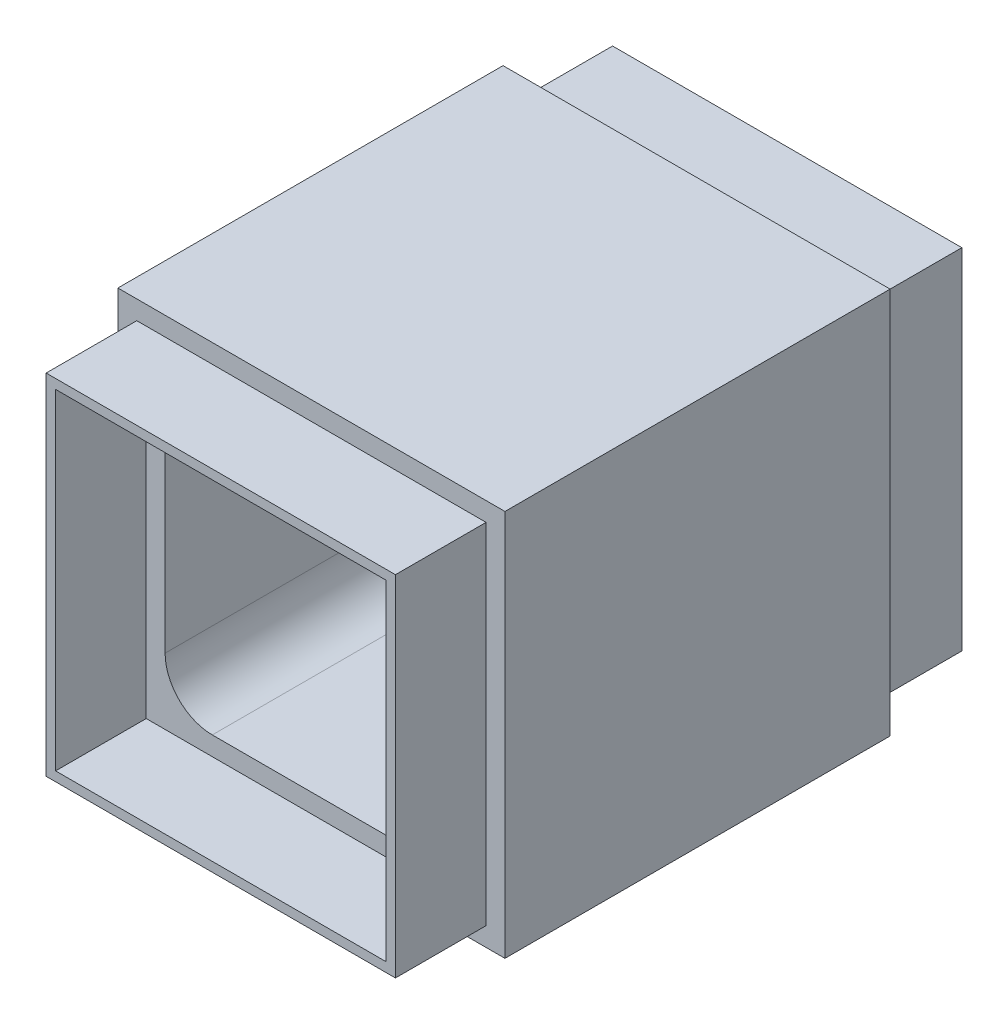
ISO-10303-21;
HEADER;
FILE_DESCRIPTION(('STEP AP214'),'2;1');
FILE_NAME('part.step','',(''),(''),'','','');
FILE_SCHEMA(('AUTOMOTIVE_DESIGN { 1 0 10303 214 1 1 1 1 }'));
ENDSEC;
DATA;
#1=APPLICATION_CONTEXT('core data for automotive mechanical design processes');
#2=APPLICATION_PROTOCOL_DEFINITION('international standard','automotive_design',2000,#1);
#3=PRODUCT_CONTEXT('',#1,'mechanical');
#4=PRODUCT('Part','Part','',(#3));
#5=PRODUCT_RELATED_PRODUCT_CATEGORY('part','',(#4));
#6=PRODUCT_DEFINITION_FORMATION('','',#4);
#7=PRODUCT_DEFINITION_CONTEXT('part definition',#1,'design');
#8=PRODUCT_DEFINITION('design','',#6,#7);
#9=PRODUCT_DEFINITION_SHAPE('','',#8);
#10=(LENGTH_UNIT() NAMED_UNIT(*) SI_UNIT(.MILLI.,.METRE.));
#11=(NAMED_UNIT(*) PLANE_ANGLE_UNIT() SI_UNIT($,.RADIAN.));
#12=(NAMED_UNIT(*) SI_UNIT($,.STERADIAN.) SOLID_ANGLE_UNIT());
#13=UNCERTAINTY_MEASURE_WITH_UNIT(LENGTH_MEASURE(1.E-05),#10,'distance_accuracy_value','');
#14=(GEOMETRIC_REPRESENTATION_CONTEXT(3) GLOBAL_UNCERTAINTY_ASSIGNED_CONTEXT((#13)) GLOBAL_UNIT_ASSIGNED_CONTEXT((#10,
#11,#12)) REPRESENTATION_CONTEXT('',''));
#15=CARTESIAN_POINT('',(0.,0.,0.));
#16=DIRECTION('',(0.,0.,1.));
#17=DIRECTION('',(1.,0.,0.));
#18=AXIS2_PLACEMENT_3D('',#15,#16,#17);
#19=CARTESIAN_POINT('',(0.,0.,-76.2));
#20=DIRECTION('',(-1.,0.,0.));
#21=DIRECTION('',(0.,0.,1.));
#22=AXIS2_PLACEMENT_3D('',#19,#20,#21);
#23=PLANE('',#22);
#24=DIRECTION('',(0.,0.,1.));
#25=VECTOR('',#24,1.);
#26=CARTESIAN_POINT('',(0.,52.07,-76.2));
#27=LINE('',#26,#25);
#28=CARTESIAN_POINT('',(0.,52.07,-64.008));
#29=VERTEX_POINT('',#28);
#30=CARTESIAN_POINT('',(0.,52.07,-12.192));
#31=VERTEX_POINT('',#30);
#32=EDGE_CURVE('E454',#29,#31,#27,.T.);
#33=ORIENTED_EDGE('',*,*,#32,.F.);
#34=DIRECTION('',(0.,-1.,0.));
#35=VECTOR('',#34,1.);
#36=CARTESIAN_POINT('',(0.,0.,-64.008));
#37=LINE('',#36,#35);
#38=CARTESIAN_POINT('',(0.,0.,-64.008));
#39=VERTEX_POINT('',#38);
#40=EDGE_CURVE('E334',#29,#39,#37,.T.);
#41=ORIENTED_EDGE('',*,*,#40,.T.);
#42=DIRECTION('',(0.,0.,1.));
#43=VECTOR('',#42,1.);
#44=CARTESIAN_POINT('',(0.,0.,-76.2));
#45=LINE('',#44,#43);
#46=CARTESIAN_POINT('',(0.,0.,-12.192));
#47=VERTEX_POINT('',#46);
#48=EDGE_CURVE('E446',#39,#47,#45,.T.);
#49=ORIENTED_EDGE('',*,*,#48,.T.);
#50=DIRECTION('',(0.,-1.,0.));
#51=VECTOR('',#50,1.);
#52=CARTESIAN_POINT('',(0.,0.,-12.192));
#53=LINE('',#52,#51);
#54=EDGE_CURVE('E413',#31,#47,#53,.T.);
#55=ORIENTED_EDGE('',*,*,#54,.F.);
#56=EDGE_LOOP('',(#33,#41,#49,#55));
#57=FACE_BOUND('',#56,.T.);
#58=ADVANCED_FACE('F83',(#57),#23,.T.);
#59=CARTESIAN_POINT('',(0.,52.07,-76.2));
#60=DIRECTION('',(0.,1.,0.));
#61=DIRECTION('',(0.,0.,1.));
#62=AXIS2_PLACEMENT_3D('',#59,#60,#61);
#63=PLANE('',#62);
#64=DIRECTION('',(0.,0.,1.));
#65=VECTOR('',#64,1.);
#66=CARTESIAN_POINT('',(52.07,52.07,-76.2));
#67=LINE('',#66,#65);
#68=CARTESIAN_POINT('',(52.07,52.07,-64.008));
#69=VERTEX_POINT('',#68);
#70=CARTESIAN_POINT('',(52.07,52.07,-12.192));
#71=VERTEX_POINT('',#70);
#72=EDGE_CURVE('E457',#69,#71,#67,.T.);
#73=ORIENTED_EDGE('',*,*,#72,.F.);
#74=DIRECTION('',(-1.,0.,0.));
#75=VECTOR('',#74,1.);
#76=CARTESIAN_POINT('',(0.,52.07,-64.008));
#77=LINE('',#76,#75);
#78=EDGE_CURVE('E324',#69,#29,#77,.T.);
#79=ORIENTED_EDGE('',*,*,#78,.T.);
#80=ORIENTED_EDGE('',*,*,#32,.T.);
#81=DIRECTION('',(-1.,0.,0.));
#82=VECTOR('',#81,1.);
#83=CARTESIAN_POINT('',(0.,52.07,-12.192));
#84=LINE('',#83,#82);
#85=EDGE_CURVE('E410',#71,#31,#84,.T.);
#86=ORIENTED_EDGE('',*,*,#85,.F.);
#87=EDGE_LOOP('',(#73,#79,#80,#86));
#88=FACE_BOUND('',#87,.T.);
#89=ADVANCED_FACE('F534',(#88),#63,.T.);
#90=CARTESIAN_POINT('',(52.07,0.,-76.2));
#91=DIRECTION('',(1.,0.,0.));
#92=DIRECTION('',(0.,0.,-1.));
#93=AXIS2_PLACEMENT_3D('',#90,#91,#92);
#94=PLANE('',#93);
#95=DIRECTION('',(0.,0.,1.));
#96=VECTOR('',#95,1.);
#97=CARTESIAN_POINT('',(52.07,0.,-76.2));
#98=LINE('',#97,#96);
#99=CARTESIAN_POINT('',(52.07,0.,-64.008));
#100=VERTEX_POINT('',#99);
#101=CARTESIAN_POINT('',(52.07,0.,-12.192));
#102=VERTEX_POINT('',#101);
#103=EDGE_CURVE('E459',#100,#102,#98,.T.);
#104=ORIENTED_EDGE('',*,*,#103,.F.);
#105=DIRECTION('',(0.,1.,0.));
#106=VECTOR('',#105,1.);
#107=CARTESIAN_POINT('',(52.07,0.,-64.008));
#108=LINE('',#107,#106);
#109=EDGE_CURVE('E327',#100,#69,#108,.T.);
#110=ORIENTED_EDGE('',*,*,#109,.T.);
#111=ORIENTED_EDGE('',*,*,#72,.T.);
#112=DIRECTION('',(0.,1.,0.));
#113=VECTOR('',#112,1.);
#114=CARTESIAN_POINT('',(52.07,0.,-12.192));
#115=LINE('',#114,#113);
#116=EDGE_CURVE('E420',#102,#71,#115,.T.);
#117=ORIENTED_EDGE('',*,*,#116,.F.);
#118=EDGE_LOOP('',(#104,#110,#111,#117));
#119=FACE_BOUND('',#118,.T.);
#120=ADVANCED_FACE('F539',(#119),#94,.T.);
#121=CARTESIAN_POINT('',(0.,0.,-76.2));
#122=DIRECTION('',(0.,-1.,0.));
#123=DIRECTION('',(0.,0.,-1.));
#124=AXIS2_PLACEMENT_3D('',#121,#122,#123);
#125=PLANE('',#124);
#126=ORIENTED_EDGE('',*,*,#48,.F.);
#127=DIRECTION('',(1.,0.,0.));
#128=VECTOR('',#127,1.);
#129=CARTESIAN_POINT('',(0.,0.,-64.008));
#130=LINE('',#129,#128);
#131=EDGE_CURVE('E331',#39,#100,#130,.T.);
#132=ORIENTED_EDGE('',*,*,#131,.T.);
#133=ORIENTED_EDGE('',*,*,#103,.T.);
#134=DIRECTION('',(1.,0.,0.));
#135=VECTOR('',#134,1.);
#136=CARTESIAN_POINT('',(0.,0.,-12.192));
#137=LINE('',#136,#135);
#138=EDGE_CURVE('E417',#47,#102,#137,.T.);
#139=ORIENTED_EDGE('',*,*,#138,.F.);
#140=EDGE_LOOP('',(#126,#132,#133,#139));
#141=FACE_BOUND('',#140,.T.);
#142=ADVANCED_FACE('F544',(#141),#125,.T.);
#143=CARTESIAN_POINT('',(6.35,45.72,-76.2));
#144=DIRECTION('',(-1.,0.,0.));
#145=DIRECTION('',(0.,-1.,0.));
#146=AXIS2_PLACEMENT_3D('',#143,#144,#145);
#147=PLANE('',#146);
#148=DIRECTION('',(0.,1.,0.));
#149=VECTOR('',#148,1.);
#150=CARTESIAN_POINT('',(6.35000000000001,0.,-64.008));
#151=LINE('',#150,#149);
#152=CARTESIAN_POINT('',(6.35,12.7,-64.008));
#153=VERTEX_POINT('',#152);
#154=CARTESIAN_POINT('',(6.35,39.37,-64.008));
#155=VERTEX_POINT('',#154);
#156=EDGE_CURVE('E308',#153,#155,#151,.T.);
#157=ORIENTED_EDGE('',*,*,#156,.T.);
#158=DIRECTION('',(0.,0.,1.));
#159=VECTOR('',#158,1.);
#160=CARTESIAN_POINT('',(6.35,39.37,-12.192));
#161=LINE('',#160,#159);
#162=CARTESIAN_POINT('',(6.35,39.37,-12.192));
#163=VERTEX_POINT('',#162);
#164=EDGE_CURVE('E463',#155,#163,#161,.T.);
#165=ORIENTED_EDGE('',*,*,#164,.T.);
#166=DIRECTION('',(0.,1.,0.));
#167=VECTOR('',#166,1.);
#168=CARTESIAN_POINT('',(6.35000000000001,0.,-12.192));
#169=LINE('',#168,#167);
#170=CARTESIAN_POINT('',(6.35,12.7,-12.192));
#171=VERTEX_POINT('',#170);
#172=EDGE_CURVE('E384',#171,#163,#169,.T.);
#173=ORIENTED_EDGE('',*,*,#172,.F.);
#174=DIRECTION('',(0.,0.,1.));
#175=VECTOR('',#174,1.);
#176=CARTESIAN_POINT('',(6.35,12.7,-64.008));
#177=LINE('',#176,#175);
#178=EDGE_CURVE('E456',#171,#153,#177,.F.);
#179=ORIENTED_EDGE('',*,*,#178,.T.);
#180=EDGE_LOOP('',(#157,#165,#173,#179));
#181=FACE_BOUND('',#180,.T.);
#182=ADVANCED_FACE('F493',(#181),#147,.F.);
#183=CARTESIAN_POINT('',(6.35,45.72,-76.2));
#184=DIRECTION('',(0.,1.,0.));
#185=DIRECTION('',(0.,0.,1.));
#186=AXIS2_PLACEMENT_3D('',#183,#184,#185);
#187=PLANE('',#186);
#188=DIRECTION('',(1.,0.,0.));
#189=VECTOR('',#188,1.);
#190=CARTESIAN_POINT('',(0.,45.72,-12.192));
#191=LINE('',#190,#189);
#192=CARTESIAN_POINT('',(12.7,45.72,-12.192));
#193=VERTEX_POINT('',#192);
#194=CARTESIAN_POINT('',(39.37,45.72,-12.192));
#195=VERTEX_POINT('',#194);
#196=EDGE_CURVE('E387',#193,#195,#191,.T.);
#197=ORIENTED_EDGE('',*,*,#196,.F.);
#198=DIRECTION('',(0.,0.,1.));
#199=VECTOR('',#198,1.);
#200=CARTESIAN_POINT('',(12.7,45.72,-64.008));
#201=LINE('',#200,#199);
#202=CARTESIAN_POINT('',(12.7,45.72,-64.008));
#203=VERTEX_POINT('',#202);
#204=EDGE_CURVE('E469',#193,#203,#201,.F.);
#205=ORIENTED_EDGE('',*,*,#204,.T.);
#206=DIRECTION('',(1.,0.,0.));
#207=VECTOR('',#206,1.);
#208=CARTESIAN_POINT('',(0.,45.72,-64.008));
#209=LINE('',#208,#207);
#210=CARTESIAN_POINT('',(39.37,45.72,-64.008));
#211=VERTEX_POINT('',#210);
#212=EDGE_CURVE('E305',#203,#211,#209,.T.);
#213=ORIENTED_EDGE('',*,*,#212,.T.);
#214=DIRECTION('',(0.,0.,1.));
#215=VECTOR('',#214,1.);
#216=CARTESIAN_POINT('',(39.37,45.72,-12.192));
#217=LINE('',#216,#215);
#218=EDGE_CURVE('E466',#211,#195,#217,.T.);
#219=ORIENTED_EDGE('',*,*,#218,.T.);
#220=EDGE_LOOP('',(#197,#205,#213,#219));
#221=FACE_BOUND('',#220,.T.);
#222=ADVANCED_FACE('F518',(#221),#187,.F.);
#223=CARTESIAN_POINT('',(45.72,45.72,-76.2));
#224=DIRECTION('',(1.,0.,0.));
#225=DIRECTION('',(0.,1.,0.));
#226=AXIS2_PLACEMENT_3D('',#223,#224,#225);
#227=PLANE('',#226);
#228=DIRECTION('',(0.,-1.,0.));
#229=VECTOR('',#228,1.);
#230=CARTESIAN_POINT('',(45.72,0.,-12.192));
#231=LINE('',#230,#229);
#232=CARTESIAN_POINT('',(45.72,39.37,-12.192));
#233=VERTEX_POINT('',#232);
#234=CARTESIAN_POINT('',(45.72,12.7,-12.192));
#235=VERTEX_POINT('',#234);
#236=EDGE_CURVE('E380',#233,#235,#231,.T.);
#237=ORIENTED_EDGE('',*,*,#236,.F.);
#238=DIRECTION('',(0.,0.,1.));
#239=VECTOR('',#238,1.);
#240=CARTESIAN_POINT('',(45.72,39.37,-64.008));
#241=LINE('',#240,#239);
#242=CARTESIAN_POINT('',(45.72,39.37,-64.008));
#243=VERTEX_POINT('',#242);
#244=EDGE_CURVE('E474',#233,#243,#241,.F.);
#245=ORIENTED_EDGE('',*,*,#244,.T.);
#246=DIRECTION('',(0.,-1.,0.));
#247=VECTOR('',#246,1.);
#248=CARTESIAN_POINT('',(45.72,0.,-64.008));
#249=LINE('',#248,#247);
#250=CARTESIAN_POINT('',(45.72,12.7,-64.008));
#251=VERTEX_POINT('',#250);
#252=EDGE_CURVE('E302',#243,#251,#249,.T.);
#253=ORIENTED_EDGE('',*,*,#252,.T.);
#254=DIRECTION('',(0.,0.,1.));
#255=VECTOR('',#254,1.);
#256=CARTESIAN_POINT('',(45.72,12.7,-12.192));
#257=LINE('',#256,#255);
#258=EDGE_CURVE('E471',#251,#235,#257,.T.);
#259=ORIENTED_EDGE('',*,*,#258,.T.);
#260=EDGE_LOOP('',(#237,#245,#253,#259));
#261=FACE_BOUND('',#260,.T.);
#262=ADVANCED_FACE('F509',(#261),#227,.F.);
#263=CARTESIAN_POINT('',(6.35,6.35,-76.2));
#264=DIRECTION('',(0.,-1.,0.));
#265=DIRECTION('',(0.,0.,-1.));
#266=AXIS2_PLACEMENT_3D('',#263,#264,#265);
#267=PLANE('',#266);
#268=DIRECTION('',(-1.,0.,0.));
#269=VECTOR('',#268,1.);
#270=CARTESIAN_POINT('',(0.,6.35,-12.192));
#271=LINE('',#270,#269);
#272=CARTESIAN_POINT('',(39.37,6.35,-12.192));
#273=VERTEX_POINT('',#272);
#274=CARTESIAN_POINT('',(12.7,6.35,-12.192));
#275=VERTEX_POINT('',#274);
#276=EDGE_CURVE('E382',#273,#275,#271,.T.);
#277=ORIENTED_EDGE('',*,*,#276,.F.);
#278=DIRECTION('',(0.,0.,1.));
#279=VECTOR('',#278,1.);
#280=CARTESIAN_POINT('',(39.37,6.35,-64.008));
#281=LINE('',#280,#279);
#282=CARTESIAN_POINT('',(39.37,6.35,-64.008));
#283=VERTEX_POINT('',#282);
#284=EDGE_CURVE('E478',#273,#283,#281,.F.);
#285=ORIENTED_EDGE('',*,*,#284,.T.);
#286=DIRECTION('',(-1.,0.,0.));
#287=VECTOR('',#286,1.);
#288=CARTESIAN_POINT('',(0.,6.35,-64.008));
#289=LINE('',#288,#287);
#290=CARTESIAN_POINT('',(12.7,6.35,-64.008));
#291=VERTEX_POINT('',#290);
#292=EDGE_CURVE('E288',#283,#291,#289,.T.);
#293=ORIENTED_EDGE('',*,*,#292,.T.);
#294=DIRECTION('',(0.,0.,1.));
#295=VECTOR('',#294,1.);
#296=CARTESIAN_POINT('',(12.7,6.35,-12.192));
#297=LINE('',#296,#295);
#298=EDGE_CURVE('E476',#291,#275,#297,.T.);
#299=ORIENTED_EDGE('',*,*,#298,.T.);
#300=EDGE_LOOP('',(#277,#285,#293,#299));
#301=FACE_BOUND('',#300,.T.);
#302=ADVANCED_FACE('F501',(#301),#267,.F.);
#303=CARTESIAN_POINT('',(48.26,0.,-12.192));
#304=DIRECTION('',(-1.,0.,0.));
#305=DIRECTION('',(0.,-1.,0.));
#306=AXIS2_PLACEMENT_3D('',#303,#304,#305);
#307=PLANE('',#306);
#308=DIRECTION('',(0.,-1.,0.));
#309=VECTOR('',#308,1.);
#310=CARTESIAN_POINT('',(48.26,0.,0.));
#311=LINE('',#310,#309);
#312=CARTESIAN_POINT('',(48.26,48.26,0.));
#313=VERTEX_POINT('',#312);
#314=CARTESIAN_POINT('',(48.26,3.81,0.));
#315=VERTEX_POINT('',#314);
#316=EDGE_CURVE('E362',#313,#315,#311,.T.);
#317=ORIENTED_EDGE('',*,*,#316,.F.);
#318=DIRECTION('',(0.,0.,1.));
#319=VECTOR('',#318,1.);
#320=CARTESIAN_POINT('',(48.26,48.26,-12.192));
#321=LINE('',#320,#319);
#322=CARTESIAN_POINT('',(48.26,48.26,-12.192));
#323=VERTEX_POINT('',#322);
#324=EDGE_CURVE('E390',#323,#313,#321,.T.);
#325=ORIENTED_EDGE('',*,*,#324,.F.);
#326=DIRECTION('',(0.,-1.,0.));
#327=VECTOR('',#326,1.);
#328=CARTESIAN_POINT('',(48.26,0.,-12.192));
#329=LINE('',#328,#327);
#330=CARTESIAN_POINT('',(48.26,3.81,-12.192));
#331=VERTEX_POINT('',#330);
#332=EDGE_CURVE('E369',#323,#331,#329,.T.);
#333=ORIENTED_EDGE('',*,*,#332,.T.);
#334=DIRECTION('',(0.,0.,1.));
#335=VECTOR('',#334,1.);
#336=CARTESIAN_POINT('',(48.26,3.81,-12.192));
#337=LINE('',#336,#335);
#338=EDGE_CURVE('E401',#331,#315,#337,.T.);
#339=ORIENTED_EDGE('',*,*,#338,.T.);
#340=EDGE_LOOP('',(#317,#325,#333,#339));
#341=FACE_BOUND('',#340,.T.);
#342=ADVANCED_FACE('F560',(#341),#307,.T.);
#343=CARTESIAN_POINT('',(0.,3.81,-12.192));
#344=DIRECTION('',(0.,-1.,0.));
#345=DIRECTION('',(0.,0.,-1.));
#346=AXIS2_PLACEMENT_3D('',#343,#344,#345);
#347=PLANE('',#346);
#348=DIRECTION('',(1.,0.,0.));
#349=VECTOR('',#348,1.);
#350=CARTESIAN_POINT('',(0.,3.81,0.));
#351=LINE('',#350,#349);
#352=CARTESIAN_POINT('',(3.81000000000001,3.81,0.));
#353=VERTEX_POINT('',#352);
#354=EDGE_CURVE('E372',#353,#315,#351,.T.);
#355=ORIENTED_EDGE('',*,*,#354,.T.);
#356=ORIENTED_EDGE('',*,*,#338,.F.);
#357=DIRECTION('',(1.,0.,0.));
#358=VECTOR('',#357,1.);
#359=CARTESIAN_POINT('',(0.,3.81,-12.192));
#360=LINE('',#359,#358);
#361=CARTESIAN_POINT('',(3.81000000000001,3.81,-12.192));
#362=VERTEX_POINT('',#361);
#363=EDGE_CURVE('E377',#362,#331,#360,.T.);
#364=ORIENTED_EDGE('',*,*,#363,.F.);
#365=DIRECTION('',(0.,0.,1.));
#366=VECTOR('',#365,1.);
#367=CARTESIAN_POINT('',(3.81000000000001,3.81,-12.192));
#368=LINE('',#367,#366);
#369=EDGE_CURVE('E404',#362,#353,#368,.T.);
#370=ORIENTED_EDGE('',*,*,#369,.T.);
#371=EDGE_LOOP('',(#355,#356,#364,#370));
#372=FACE_BOUND('',#371,.T.);
#373=ADVANCED_FACE('F587',(#372),#347,.F.);
#374=CARTESIAN_POINT('',(3.81000000000001,0.,-12.192));
#375=DIRECTION('',(-1.,0.,0.));
#376=DIRECTION('',(0.,-1.,0.));
#377=AXIS2_PLACEMENT_3D('',#374,#375,#376);
#378=PLANE('',#377);
#379=DIRECTION('',(0.,-1.,0.));
#380=VECTOR('',#379,1.);
#381=CARTESIAN_POINT('',(3.81000000000001,0.,0.));
#382=LINE('',#381,#380);
#383=CARTESIAN_POINT('',(3.81,48.26,0.));
#384=VERTEX_POINT('',#383);
#385=EDGE_CURVE('E396',#384,#353,#382,.T.);
#386=ORIENTED_EDGE('',*,*,#385,.T.);
#387=ORIENTED_EDGE('',*,*,#369,.F.);
#388=DIRECTION('',(0.,-1.,0.));
#389=VECTOR('',#388,1.);
#390=CARTESIAN_POINT('',(3.81000000000001,0.,-12.192));
#391=LINE('',#390,#389);
#392=CARTESIAN_POINT('',(3.81,48.26,-12.192));
#393=VERTEX_POINT('',#392);
#394=EDGE_CURVE('E374',#393,#362,#391,.T.);
#395=ORIENTED_EDGE('',*,*,#394,.F.);
#396=DIRECTION('',(0.,0.,1.));
#397=VECTOR('',#396,1.);
#398=CARTESIAN_POINT('',(3.81,48.26,-12.192));
#399=LINE('',#398,#397);
#400=EDGE_CURVE('E406',#393,#384,#399,.T.);
#401=ORIENTED_EDGE('',*,*,#400,.T.);
#402=EDGE_LOOP('',(#386,#387,#395,#401));
#403=FACE_BOUND('',#402,.T.);
#404=ADVANCED_FACE('F592',(#403),#378,.F.);
#405=CARTESIAN_POINT('',(0.,48.26,-12.192));
#406=DIRECTION('',(0.,-1.,0.));
#407=DIRECTION('',(0.,0.,-1.));
#408=AXIS2_PLACEMENT_3D('',#405,#406,#407);
#409=PLANE('',#408);
#410=DIRECTION('',(1.,0.,0.));
#411=VECTOR('',#410,1.);
#412=CARTESIAN_POINT('',(0.,48.26,0.));
#413=LINE('',#412,#411);
#414=EDGE_CURVE('E393',#384,#313,#413,.T.);
#415=ORIENTED_EDGE('',*,*,#414,.F.);
#416=ORIENTED_EDGE('',*,*,#400,.F.);
#417=DIRECTION('',(1.,0.,0.));
#418=VECTOR('',#417,1.);
#419=CARTESIAN_POINT('',(0.,48.26,-12.192));
#420=LINE('',#419,#418);
#421=EDGE_CURVE('E371',#393,#323,#420,.T.);
#422=ORIENTED_EDGE('',*,*,#421,.T.);
#423=ORIENTED_EDGE('',*,*,#324,.T.);
#424=EDGE_LOOP('',(#415,#416,#422,#423));
#425=FACE_BOUND('',#424,.T.);
#426=ADVANCED_FACE('F589',(#425),#409,.T.);
#427=CARTESIAN_POINT('',(0.,0.,-12.192));
#428=DIRECTION('',(0.,0.,1.));
#429=DIRECTION('',(1.,0.,0.));
#430=AXIS2_PLACEMENT_3D('',#427,#428,#429);
#431=PLANE('',#430);
#432=ORIENTED_EDGE('',*,*,#332,.F.);
#433=ORIENTED_EDGE('',*,*,#421,.F.);
#434=ORIENTED_EDGE('',*,*,#394,.T.);
#435=ORIENTED_EDGE('',*,*,#363,.T.);
#436=EDGE_LOOP('',(#432,#433,#434,#435));
#437=FACE_BOUND('',#436,.T.);
#438=ORIENTED_EDGE('',*,*,#196,.T.);
#439=CARTESIAN_POINT('',(39.37,39.37,-12.192));
#440=DIRECTION('',(0.,0.,1.));
#441=DIRECTION('',(1.,0.,0.));
#442=AXIS2_PLACEMENT_3D('',#439,#440,#441);
#443=CIRCLE('',#442,6.35);
#444=EDGE_CURVE('E484',#195,#233,#443,.F.);
#445=ORIENTED_EDGE('',*,*,#444,.T.);
#446=ORIENTED_EDGE('',*,*,#236,.T.);
#447=CARTESIAN_POINT('',(39.37,12.7,-12.192));
#448=DIRECTION('',(0.,0.,1.));
#449=DIRECTION('',(1.,0.,0.));
#450=AXIS2_PLACEMENT_3D('',#447,#448,#449);
#451=CIRCLE('',#450,6.35);
#452=EDGE_CURVE('E105',#235,#273,#451,.F.);
#453=ORIENTED_EDGE('',*,*,#452,.T.);
#454=ORIENTED_EDGE('',*,*,#276,.T.);
#455=CARTESIAN_POINT('',(12.7,12.7,-12.192));
#456=DIRECTION('',(0.,0.,1.));
#457=DIRECTION('',(1.,0.,0.));
#458=AXIS2_PLACEMENT_3D('',#455,#456,#457);
#459=CIRCLE('',#458,6.35);
#460=EDGE_CURVE('E91',#275,#171,#459,.F.);
#461=ORIENTED_EDGE('',*,*,#460,.T.);
#462=ORIENTED_EDGE('',*,*,#172,.T.);
#463=CARTESIAN_POINT('',(12.7,39.37,-12.192));
#464=DIRECTION('',(0.,0.,1.));
#465=DIRECTION('',(1.,0.,0.));
#466=AXIS2_PLACEMENT_3D('',#463,#464,#465);
#467=CIRCLE('',#466,6.35);
#468=EDGE_CURVE('E480',#163,#193,#467,.F.);
#469=ORIENTED_EDGE('',*,*,#468,.T.);
#470=EDGE_LOOP('',(#438,#445,#446,#453,#454,#461,#462,#469));
#471=FACE_BOUND('',#470,.T.);
#472=ADVANCED_FACE('F491',(#437,#471),#431,.T.);
#473=CARTESIAN_POINT('',(0.,0.,0.));
#474=DIRECTION('',(0.,0.,-1.));
#475=DIRECTION('',(-1.,0.,0.));
#476=AXIS2_PLACEMENT_3D('',#473,#474,#475);
#477=PLANE('',#476);
#478=DIRECTION('',(0.,-1.,0.));
#479=VECTOR('',#478,1.);
#480=CARTESIAN_POINT('',(49.53,0.,0.));
#481=LINE('',#480,#479);
#482=CARTESIAN_POINT('',(49.53,49.53,0.));
#483=VERTEX_POINT('',#482);
#484=CARTESIAN_POINT('',(49.53,2.54,0.));
#485=VERTEX_POINT('',#484);
#486=EDGE_CURVE('E436',#483,#485,#481,.T.);
#487=ORIENTED_EDGE('',*,*,#486,.F.);
#488=DIRECTION('',(1.,0.,0.));
#489=VECTOR('',#488,1.);
#490=CARTESIAN_POINT('',(0.,49.53,0.));
#491=LINE('',#490,#489);
#492=CARTESIAN_POINT('',(2.54,49.53,0.));
#493=VERTEX_POINT('',#492);
#494=EDGE_CURVE('E403',#493,#483,#491,.T.);
#495=ORIENTED_EDGE('',*,*,#494,.F.);
#496=DIRECTION('',(0.,-1.,0.));
#497=VECTOR('',#496,1.);
#498=CARTESIAN_POINT('',(2.54000000000001,0.,0.));
#499=LINE('',#498,#497);
#500=CARTESIAN_POINT('',(2.54000000000001,2.54,0.));
#501=VERTEX_POINT('',#500);
#502=EDGE_CURVE('E414',#493,#501,#499,.T.);
#503=ORIENTED_EDGE('',*,*,#502,.T.);
#504=DIRECTION('',(1.,0.,0.));
#505=VECTOR('',#504,1.);
#506=CARTESIAN_POINT('',(0.,2.54,0.));
#507=LINE('',#506,#505);
#508=EDGE_CURVE('E439',#501,#485,#507,.T.);
#509=ORIENTED_EDGE('',*,*,#508,.T.);
#510=EDGE_LOOP('',(#487,#495,#503,#509));
#511=FACE_BOUND('',#510,.T.);
#512=ORIENTED_EDGE('',*,*,#316,.T.);
#513=ORIENTED_EDGE('',*,*,#354,.F.);
#514=ORIENTED_EDGE('',*,*,#385,.F.);
#515=ORIENTED_EDGE('',*,*,#414,.T.);
#516=EDGE_LOOP('',(#512,#513,#514,#515));
#517=FACE_BOUND('',#516,.T.);
#518=ADVANCED_FACE('F551',(#511,#517),#477,.F.);
#519=CARTESIAN_POINT('',(0.,49.53,-12.192));
#520=DIRECTION('',(0.,-1.,0.));
#521=DIRECTION('',(0.,0.,-1.));
#522=AXIS2_PLACEMENT_3D('',#519,#520,#521);
#523=PLANE('',#522);
#524=ORIENTED_EDGE('',*,*,#494,.T.);
#525=DIRECTION('',(0.,0.,1.));
#526=VECTOR('',#525,1.);
#527=CARTESIAN_POINT('',(49.53,49.53,-12.192));
#528=LINE('',#527,#526);
#529=CARTESIAN_POINT('',(49.53,49.53,-12.192));
#530=VERTEX_POINT('',#529);
#531=EDGE_CURVE('E434',#530,#483,#528,.T.);
#532=ORIENTED_EDGE('',*,*,#531,.F.);
#533=DIRECTION('',(1.,0.,0.));
#534=VECTOR('',#533,1.);
#535=CARTESIAN_POINT('',(0.,49.53,-12.192));
#536=LINE('',#535,#534);
#537=CARTESIAN_POINT('',(2.54,49.53,-12.192));
#538=VERTEX_POINT('',#537);
#539=EDGE_CURVE('E423',#538,#530,#536,.T.);
#540=ORIENTED_EDGE('',*,*,#539,.F.);
#541=DIRECTION('',(0.,0.,1.));
#542=VECTOR('',#541,1.);
#543=CARTESIAN_POINT('',(2.54,49.53,-12.192));
#544=LINE('',#543,#542);
#545=EDGE_CURVE('E444',#538,#493,#544,.T.);
#546=ORIENTED_EDGE('',*,*,#545,.T.);
#547=EDGE_LOOP('',(#524,#532,#540,#546));
#548=FACE_BOUND('',#547,.T.);
#549=ADVANCED_FACE('F553',(#548),#523,.F.);
#550=CARTESIAN_POINT('',(2.54000000000001,0.,-12.192));
#551=DIRECTION('',(-1.,0.,0.));
#552=DIRECTION('',(0.,-1.,0.));
#553=AXIS2_PLACEMENT_3D('',#550,#551,#552);
#554=PLANE('',#553);
#555=ORIENTED_EDGE('',*,*,#502,.F.);
#556=ORIENTED_EDGE('',*,*,#545,.F.);
#557=DIRECTION('',(0.,-1.,0.));
#558=VECTOR('',#557,1.);
#559=CARTESIAN_POINT('',(2.54000000000001,0.,-12.192));
#560=LINE('',#559,#558);
#561=CARTESIAN_POINT('',(2.54000000000001,2.54,-12.192));
#562=VERTEX_POINT('',#561);
#563=EDGE_CURVE('E431',#538,#562,#560,.T.);
#564=ORIENTED_EDGE('',*,*,#563,.T.);
#565=DIRECTION('',(0.,0.,1.));
#566=VECTOR('',#565,1.);
#567=CARTESIAN_POINT('',(2.54000000000001,2.54,-12.192));
#568=LINE('',#567,#566);
#569=EDGE_CURVE('E447',#562,#501,#568,.T.);
#570=ORIENTED_EDGE('',*,*,#569,.T.);
#571=EDGE_LOOP('',(#555,#556,#564,#570));
#572=FACE_BOUND('',#571,.T.);
#573=ADVANCED_FACE('F567',(#572),#554,.T.);
#574=CARTESIAN_POINT('',(0.,2.54,-12.192));
#575=DIRECTION('',(0.,-1.,0.));
#576=DIRECTION('',(0.,0.,-1.));
#577=AXIS2_PLACEMENT_3D('',#574,#575,#576);
#578=PLANE('',#577);
#579=ORIENTED_EDGE('',*,*,#508,.F.);
#580=ORIENTED_EDGE('',*,*,#569,.F.);
#581=DIRECTION('',(1.,0.,0.));
#582=VECTOR('',#581,1.);
#583=CARTESIAN_POINT('',(0.,2.54,-12.192));
#584=LINE('',#583,#582);
#585=CARTESIAN_POINT('',(49.53,2.54,-12.192));
#586=VERTEX_POINT('',#585);
#587=EDGE_CURVE('E429',#562,#586,#584,.T.);
#588=ORIENTED_EDGE('',*,*,#587,.T.);
#589=DIRECTION('',(0.,0.,1.));
#590=VECTOR('',#589,1.);
#591=CARTESIAN_POINT('',(49.53,2.54,-12.192));
#592=LINE('',#591,#590);
#593=EDGE_CURVE('E450',#586,#485,#592,.T.);
#594=ORIENTED_EDGE('',*,*,#593,.T.);
#595=EDGE_LOOP('',(#579,#580,#588,#594));
#596=FACE_BOUND('',#595,.T.);
#597=ADVANCED_FACE('F573',(#596),#578,.T.);
#598=CARTESIAN_POINT('',(49.53,0.,-12.192));
#599=DIRECTION('',(-1.,0.,0.));
#600=DIRECTION('',(0.,-1.,0.));
#601=AXIS2_PLACEMENT_3D('',#598,#599,#600);
#602=PLANE('',#601);
#603=ORIENTED_EDGE('',*,*,#486,.T.);
#604=ORIENTED_EDGE('',*,*,#593,.F.);
#605=DIRECTION('',(0.,-1.,0.));
#606=VECTOR('',#605,1.);
#607=CARTESIAN_POINT('',(49.53,0.,-12.192));
#608=LINE('',#607,#606);
#609=EDGE_CURVE('E426',#530,#586,#608,.T.);
#610=ORIENTED_EDGE('',*,*,#609,.F.);
#611=ORIENTED_EDGE('',*,*,#531,.T.);
#612=EDGE_LOOP('',(#603,#604,#610,#611));
#613=FACE_BOUND('',#612,.T.);
#614=ADVANCED_FACE('F569',(#613),#602,.F.);
#615=CARTESIAN_POINT('',(0.,0.,-12.192));
#616=DIRECTION('',(0.,0.,1.));
#617=DIRECTION('',(1.,0.,0.));
#618=AXIS2_PLACEMENT_3D('',#615,#616,#617);
#619=PLANE('',#618);
#620=ORIENTED_EDGE('',*,*,#85,.T.);
#621=ORIENTED_EDGE('',*,*,#54,.T.);
#622=ORIENTED_EDGE('',*,*,#138,.T.);
#623=ORIENTED_EDGE('',*,*,#116,.T.);
#624=EDGE_LOOP('',(#620,#621,#622,#623));
#625=FACE_BOUND('',#624,.T.);
#626=ORIENTED_EDGE('',*,*,#539,.T.);
#627=ORIENTED_EDGE('',*,*,#609,.T.);
#628=ORIENTED_EDGE('',*,*,#587,.F.);
#629=ORIENTED_EDGE('',*,*,#563,.F.);
#630=EDGE_LOOP('',(#626,#627,#628,#629));
#631=FACE_BOUND('',#630,.T.);
#632=ADVANCED_FACE('F572',(#625,#631),#619,.T.);
#633=CARTESIAN_POINT('',(0.,49.53,-64.008));
#634=DIRECTION('',(0.,1.,0.));
#635=DIRECTION('',(0.,0.,1.));
#636=AXIS2_PLACEMENT_3D('',#633,#634,#635);
#637=PLANE('',#636);
#638=DIRECTION('',(1.,0.,0.));
#639=VECTOR('',#638,1.);
#640=CARTESIAN_POINT('',(0.,49.53,-76.2));
#641=LINE('',#640,#639);
#642=CARTESIAN_POINT('',(2.54,49.53,-76.2));
#643=VERTEX_POINT('',#642);
#644=CARTESIAN_POINT('',(49.53,49.53,-76.2));
#645=VERTEX_POINT('',#644);
#646=EDGE_CURVE('E320',#643,#645,#641,.T.);
#647=ORIENTED_EDGE('',*,*,#646,.F.);
#648=DIRECTION('',(0.,0.,-1.));
#649=VECTOR('',#648,1.);
#650=CARTESIAN_POINT('',(2.54,49.53,-64.008));
#651=LINE('',#650,#649);
#652=CARTESIAN_POINT('',(2.54,49.53,-64.008));
#653=VERTEX_POINT('',#652);
#654=EDGE_CURVE('E348',#653,#643,#651,.T.);
#655=ORIENTED_EDGE('',*,*,#654,.F.);
#656=DIRECTION('',(1.,0.,0.));
#657=VECTOR('',#656,1.);
#658=CARTESIAN_POINT('',(0.,49.53,-64.008));
#659=LINE('',#658,#657);
#660=CARTESIAN_POINT('',(49.53,49.53,-64.008));
#661=VERTEX_POINT('',#660);
#662=EDGE_CURVE('E337',#653,#661,#659,.T.);
#663=ORIENTED_EDGE('',*,*,#662,.T.);
#664=DIRECTION('',(0.,0.,-1.));
#665=VECTOR('',#664,1.);
#666=CARTESIAN_POINT('',(49.53,49.53,-64.008));
#667=LINE('',#666,#665);
#668=EDGE_CURVE('E359',#661,#645,#667,.T.);
#669=ORIENTED_EDGE('',*,*,#668,.T.);
#670=EDGE_LOOP('',(#647,#655,#663,#669));
#671=FACE_BOUND('',#670,.T.);
#672=ADVANCED_FACE('F583',(#671),#637,.T.);
#673=CARTESIAN_POINT('',(49.53,0.,-64.008));
#674=DIRECTION('',(1.,0.,0.));
#675=DIRECTION('',(0.,1.,0.));
#676=AXIS2_PLACEMENT_3D('',#673,#674,#675);
#677=PLANE('',#676);
#678=DIRECTION('',(0.,-1.,0.));
#679=VECTOR('',#678,1.);
#680=CARTESIAN_POINT('',(49.53,0.,-76.2));
#681=LINE('',#680,#679);
#682=CARTESIAN_POINT('',(49.53,2.54,-76.2));
#683=VERTEX_POINT('',#682);
#684=EDGE_CURVE('E328',#645,#683,#681,.T.);
#685=ORIENTED_EDGE('',*,*,#684,.F.);
#686=ORIENTED_EDGE('',*,*,#668,.F.);
#687=DIRECTION('',(0.,-1.,0.));
#688=VECTOR('',#687,1.);
#689=CARTESIAN_POINT('',(49.53,0.,-64.008));
#690=LINE('',#689,#688);
#691=CARTESIAN_POINT('',(49.53,2.54,-64.008));
#692=VERTEX_POINT('',#691);
#693=EDGE_CURVE('E346',#661,#692,#690,.T.);
#694=ORIENTED_EDGE('',*,*,#693,.T.);
#695=DIRECTION('',(0.,0.,-1.));
#696=VECTOR('',#695,1.);
#697=CARTESIAN_POINT('',(49.53,2.54,-64.008));
#698=LINE('',#697,#696);
#699=EDGE_CURVE('E363',#692,#683,#698,.T.);
#700=ORIENTED_EDGE('',*,*,#699,.T.);
#701=EDGE_LOOP('',(#685,#686,#694,#700));
#702=FACE_BOUND('',#701,.T.);
#703=ADVANCED_FACE('F605',(#702),#677,.T.);
#704=CARTESIAN_POINT('',(0.,2.54,-64.008));
#705=DIRECTION('',(0.,1.,0.));
#706=DIRECTION('',(0.,0.,1.));
#707=AXIS2_PLACEMENT_3D('',#704,#705,#706);
#708=PLANE('',#707);
#709=DIRECTION('',(1.,0.,0.));
#710=VECTOR('',#709,1.);
#711=CARTESIAN_POINT('',(0.,2.54,-76.2));
#712=LINE('',#711,#710);
#713=CARTESIAN_POINT('',(2.54000000000001,2.54,-76.2));
#714=VERTEX_POINT('',#713);
#715=EDGE_CURVE('E354',#714,#683,#712,.T.);
#716=ORIENTED_EDGE('',*,*,#715,.T.);
#717=ORIENTED_EDGE('',*,*,#699,.F.);
#718=DIRECTION('',(1.,0.,0.));
#719=VECTOR('',#718,1.);
#720=CARTESIAN_POINT('',(0.,2.54,-64.008));
#721=LINE('',#720,#719);
#722=CARTESIAN_POINT('',(2.54000000000001,2.54,-64.008));
#723=VERTEX_POINT('',#722);
#724=EDGE_CURVE('E343',#723,#692,#721,.T.);
#725=ORIENTED_EDGE('',*,*,#724,.F.);
#726=DIRECTION('',(0.,0.,-1.));
#727=VECTOR('',#726,1.);
#728=CARTESIAN_POINT('',(2.54000000000001,2.54,-64.008));
#729=LINE('',#728,#727);
#730=EDGE_CURVE('E365',#723,#714,#729,.T.);
#731=ORIENTED_EDGE('',*,*,#730,.T.);
#732=EDGE_LOOP('',(#716,#717,#725,#731));
#733=FACE_BOUND('',#732,.T.);
#734=ADVANCED_FACE('F611',(#733),#708,.F.);
#735=CARTESIAN_POINT('',(2.54000000000001,0.,-64.008));
#736=DIRECTION('',(1.,0.,0.));
#737=DIRECTION('',(0.,1.,0.));
#738=AXIS2_PLACEMENT_3D('',#735,#736,#737);
#739=PLANE('',#738);
#740=DIRECTION('',(0.,-1.,0.));
#741=VECTOR('',#740,1.);
#742=CARTESIAN_POINT('',(2.54000000000001,0.,-76.2));
#743=LINE('',#742,#741);
#744=EDGE_CURVE('E351',#643,#714,#743,.T.);
#745=ORIENTED_EDGE('',*,*,#744,.T.);
#746=ORIENTED_EDGE('',*,*,#730,.F.);
#747=DIRECTION('',(0.,-1.,0.));
#748=VECTOR('',#747,1.);
#749=CARTESIAN_POINT('',(2.54000000000001,0.,-64.008));
#750=LINE('',#749,#748);
#751=EDGE_CURVE('E340',#653,#723,#750,.T.);
#752=ORIENTED_EDGE('',*,*,#751,.F.);
#753=ORIENTED_EDGE('',*,*,#654,.T.);
#754=EDGE_LOOP('',(#745,#746,#752,#753));
#755=FACE_BOUND('',#754,.T.);
#756=ADVANCED_FACE('F607',(#755),#739,.F.);
#757=CARTESIAN_POINT('',(0.,0.,-64.008));
#758=DIRECTION('',(0.,0.,-1.));
#759=DIRECTION('',(1.,0.,0.));
#760=AXIS2_PLACEMENT_3D('',#757,#758,#759);
#761=PLANE('',#760);
#762=ORIENTED_EDGE('',*,*,#78,.F.);
#763=ORIENTED_EDGE('',*,*,#109,.F.);
#764=ORIENTED_EDGE('',*,*,#131,.F.);
#765=ORIENTED_EDGE('',*,*,#40,.F.);
#766=EDGE_LOOP('',(#762,#763,#764,#765));
#767=FACE_BOUND('',#766,.T.);
#768=ORIENTED_EDGE('',*,*,#662,.F.);
#769=ORIENTED_EDGE('',*,*,#751,.T.);
#770=ORIENTED_EDGE('',*,*,#724,.T.);
#771=ORIENTED_EDGE('',*,*,#693,.F.);
#772=EDGE_LOOP('',(#768,#769,#770,#771));
#773=FACE_BOUND('',#772,.T.);
#774=ADVANCED_FACE('F610',(#767,#773),#761,.T.);
#775=CARTESIAN_POINT('',(48.26,0.,-64.008));
#776=DIRECTION('',(1.,0.,0.));
#777=DIRECTION('',(0.,1.,0.));
#778=AXIS2_PLACEMENT_3D('',#775,#776,#777);
#779=PLANE('',#778);
#780=DIRECTION('',(0.,-1.,0.));
#781=VECTOR('',#780,1.);
#782=CARTESIAN_POINT('',(48.26,0.,-76.2));
#783=LINE('',#782,#781);
#784=CARTESIAN_POINT('',(48.26,48.26,-76.2));
#785=VERTEX_POINT('',#784);
#786=CARTESIAN_POINT('',(48.26,3.81,-76.2));
#787=VERTEX_POINT('',#786);
#788=EDGE_CURVE('E287',#785,#787,#783,.T.);
#789=ORIENTED_EDGE('',*,*,#788,.T.);
#790=DIRECTION('',(0.,0.,-1.));
#791=VECTOR('',#790,1.);
#792=CARTESIAN_POINT('',(48.26,3.81,-64.008));
#793=LINE('',#792,#791);
#794=CARTESIAN_POINT('',(48.26,3.81,-64.008));
#795=VERTEX_POINT('',#794);
#796=EDGE_CURVE('E273',#795,#787,#793,.T.);
#797=ORIENTED_EDGE('',*,*,#796,.F.);
#798=DIRECTION('',(0.,-1.,0.));
#799=VECTOR('',#798,1.);
#800=CARTESIAN_POINT('',(48.26,0.,-64.008));
#801=LINE('',#800,#799);
#802=CARTESIAN_POINT('',(48.26,48.26,-64.008));
#803=VERTEX_POINT('',#802);
#804=EDGE_CURVE('E280',#803,#795,#801,.T.);
#805=ORIENTED_EDGE('',*,*,#804,.F.);
#806=DIRECTION('',(0.,0.,-1.));
#807=VECTOR('',#806,1.);
#808=CARTESIAN_POINT('',(48.26,48.26,-64.008));
#809=LINE('',#808,#807);
#810=EDGE_CURVE('E318',#803,#785,#809,.T.);
#811=ORIENTED_EDGE('',*,*,#810,.T.);
#812=EDGE_LOOP('',(#789,#797,#805,#811));
#813=FACE_BOUND('',#812,.T.);
#814=ADVANCED_FACE('F284',(#813),#779,.F.);
#815=CARTESIAN_POINT('',(0.,48.26,-64.008));
#816=DIRECTION('',(0.,1.,0.));
#817=DIRECTION('',(0.,0.,1.));
#818=AXIS2_PLACEMENT_3D('',#815,#816,#817);
#819=PLANE('',#818);
#820=DIRECTION('',(1.,0.,0.));
#821=VECTOR('',#820,1.);
#822=CARTESIAN_POINT('',(0.,48.26,-76.2));
#823=LINE('',#822,#821);
#824=CARTESIAN_POINT('',(3.81,48.26,-76.2));
#825=VERTEX_POINT('',#824);
#826=EDGE_CURVE('E294',#825,#785,#823,.T.);
#827=ORIENTED_EDGE('',*,*,#826,.T.);
#828=ORIENTED_EDGE('',*,*,#810,.F.);
#829=DIRECTION('',(1.,0.,0.));
#830=VECTOR('',#829,1.);
#831=CARTESIAN_POINT('',(0.,48.26,-64.008));
#832=LINE('',#831,#830);
#833=CARTESIAN_POINT('',(3.81,48.26,-64.008));
#834=VERTEX_POINT('',#833);
#835=EDGE_CURVE('E293',#834,#803,#832,.T.);
#836=ORIENTED_EDGE('',*,*,#835,.F.);
#837=DIRECTION('',(0.,0.,-1.));
#838=VECTOR('',#837,1.);
#839=CARTESIAN_POINT('',(3.81,48.26,-64.008));
#840=LINE('',#839,#838);
#841=EDGE_CURVE('E321',#834,#825,#840,.T.);
#842=ORIENTED_EDGE('',*,*,#841,.T.);
#843=EDGE_LOOP('',(#827,#828,#836,#842));
#844=FACE_BOUND('',#843,.T.);
#845=ADVANCED_FACE('F624',(#844),#819,.F.);
#846=CARTESIAN_POINT('',(3.81000000000001,0.,-64.008));
#847=DIRECTION('',(1.,0.,0.));
#848=DIRECTION('',(0.,1.,0.));
#849=AXIS2_PLACEMENT_3D('',#846,#847,#848);
#850=PLANE('',#849);
#851=DIRECTION('',(0.,-1.,0.));
#852=VECTOR('',#851,1.);
#853=CARTESIAN_POINT('',(3.81000000000001,0.,-76.2));
#854=LINE('',#853,#852);
#855=CARTESIAN_POINT('',(3.81000000000001,3.81,-76.2));
#856=VERTEX_POINT('',#855);
#857=EDGE_CURVE('E297',#825,#856,#854,.T.);
#858=ORIENTED_EDGE('',*,*,#857,.F.);
#859=ORIENTED_EDGE('',*,*,#841,.F.);
#860=DIRECTION('',(0.,-1.,0.));
#861=VECTOR('',#860,1.);
#862=CARTESIAN_POINT('',(3.81000000000001,0.,-64.008));
#863=LINE('',#862,#861);
#864=CARTESIAN_POINT('',(3.81000000000001,3.81,-64.008));
#865=VERTEX_POINT('',#864);
#866=EDGE_CURVE('E279',#834,#865,#863,.T.);
#867=ORIENTED_EDGE('',*,*,#866,.T.);
#868=DIRECTION('',(0.,0.,-1.));
#869=VECTOR('',#868,1.);
#870=CARTESIAN_POINT('',(3.81000000000001,3.81,-64.008));
#871=LINE('',#870,#869);
#872=EDGE_CURVE('E275',#865,#856,#871,.T.);
#873=ORIENTED_EDGE('',*,*,#872,.T.);
#874=EDGE_LOOP('',(#858,#859,#867,#873));
#875=FACE_BOUND('',#874,.T.);
#876=ADVANCED_FACE('F627',(#875),#850,.T.);
#877=CARTESIAN_POINT('',(0.,3.81,-64.008));
#878=DIRECTION('',(0.,1.,0.));
#879=DIRECTION('',(0.,0.,1.));
#880=AXIS2_PLACEMENT_3D('',#877,#878,#879);
#881=PLANE('',#880);
#882=DIRECTION('',(1.,0.,0.));
#883=VECTOR('',#882,1.);
#884=CARTESIAN_POINT('',(0.,3.81,-76.2));
#885=LINE('',#884,#883);
#886=EDGE_CURVE('E314',#856,#787,#885,.T.);
#887=ORIENTED_EDGE('',*,*,#886,.F.);
#888=ORIENTED_EDGE('',*,*,#872,.F.);
#889=DIRECTION('',(1.,0.,0.));
#890=VECTOR('',#889,1.);
#891=CARTESIAN_POINT('',(0.,3.81,-64.008));
#892=LINE('',#891,#890);
#893=EDGE_CURVE('E269',#865,#795,#892,.T.);
#894=ORIENTED_EDGE('',*,*,#893,.T.);
#895=ORIENTED_EDGE('',*,*,#796,.T.);
#896=EDGE_LOOP('',(#887,#888,#894,#895));
#897=FACE_BOUND('',#896,.T.);
#898=ADVANCED_FACE('F272',(#897),#881,.T.);
#899=CARTESIAN_POINT('',(0.,0.,-64.008));
#900=DIRECTION('',(0.,0.,-1.));
#901=DIRECTION('',(1.,0.,0.));
#902=AXIS2_PLACEMENT_3D('',#899,#900,#901);
#903=PLANE('',#902);
#904=ORIENTED_EDGE('',*,*,#804,.T.);
#905=ORIENTED_EDGE('',*,*,#893,.F.);
#906=ORIENTED_EDGE('',*,*,#866,.F.);
#907=ORIENTED_EDGE('',*,*,#835,.T.);
#908=EDGE_LOOP('',(#904,#905,#906,#907));
#909=FACE_BOUND('',#908,.T.);
#910=ORIENTED_EDGE('',*,*,#252,.F.);
#911=CARTESIAN_POINT('',(39.37,39.37,-64.008));
#912=DIRECTION('',(0.,0.,-1.));
#913=DIRECTION('',(-1.,0.,0.));
#914=AXIS2_PLACEMENT_3D('',#911,#912,#913);
#915=CIRCLE('',#914,6.35);
#916=EDGE_CURVE('E486',#243,#211,#915,.F.);
#917=ORIENTED_EDGE('',*,*,#916,.T.);
#918=ORIENTED_EDGE('',*,*,#212,.F.);
#919=CARTESIAN_POINT('',(12.7,39.37,-64.008));
#920=DIRECTION('',(0.,0.,-1.));
#921=DIRECTION('',(-1.,0.,0.));
#922=AXIS2_PLACEMENT_3D('',#919,#920,#921);
#923=CIRCLE('',#922,6.35);
#924=EDGE_CURVE('E482',#203,#155,#923,.F.);
#925=ORIENTED_EDGE('',*,*,#924,.T.);
#926=ORIENTED_EDGE('',*,*,#156,.F.);
#927=CARTESIAN_POINT('',(12.7,12.7,-64.008));
#928=DIRECTION('',(0.,0.,-1.));
#929=DIRECTION('',(-1.,0.,0.));
#930=AXIS2_PLACEMENT_3D('',#927,#928,#929);
#931=CIRCLE('',#930,6.35);
#932=EDGE_CURVE('E12',#153,#291,#931,.F.);
#933=ORIENTED_EDGE('',*,*,#932,.T.);
#934=ORIENTED_EDGE('',*,*,#292,.F.);
#935=CARTESIAN_POINT('',(39.37,12.7,-64.008));
#936=DIRECTION('',(0.,0.,-1.));
#937=DIRECTION('',(-1.,0.,0.));
#938=AXIS2_PLACEMENT_3D('',#935,#936,#937);
#939=CIRCLE('',#938,6.35);
#940=EDGE_CURVE('E489',#283,#251,#939,.F.);
#941=ORIENTED_EDGE('',*,*,#940,.T.);
#942=EDGE_LOOP('',(#910,#917,#918,#925,#926,#933,#934,#941));
#943=FACE_BOUND('',#942,.T.);
#944=ADVANCED_FACE('F290',(#909,#943),#903,.T.);
#945=CARTESIAN_POINT('',(0.,0.,-76.2));
#946=DIRECTION('',(0.,0.,-1.));
#947=DIRECTION('',(-1.,0.,0.));
#948=AXIS2_PLACEMENT_3D('',#945,#946,#947);
#949=PLANE('',#948);
#950=ORIENTED_EDGE('',*,*,#788,.F.);
#951=ORIENTED_EDGE('',*,*,#826,.F.);
#952=ORIENTED_EDGE('',*,*,#857,.T.);
#953=ORIENTED_EDGE('',*,*,#886,.T.);
#954=EDGE_LOOP('',(#950,#951,#952,#953));
#955=FACE_BOUND('',#954,.T.);
#956=ORIENTED_EDGE('',*,*,#744,.F.);
#957=ORIENTED_EDGE('',*,*,#646,.T.);
#958=ORIENTED_EDGE('',*,*,#684,.T.);
#959=ORIENTED_EDGE('',*,*,#715,.F.);
#960=EDGE_LOOP('',(#956,#957,#958,#959));
#961=FACE_BOUND('',#960,.T.);
#962=ADVANCED_FACE('F523',(#955,#961),#949,.T.);
#963=CARTESIAN_POINT('',(12.7,39.37,-76.2));
#964=DIRECTION('',(0.,0.,-1.));
#965=DIRECTION('',(-1.,0.,0.));
#966=AXIS2_PLACEMENT_3D('',#963,#964,#965);
#967=CYLINDRICAL_SURFACE('',#966,6.35);
#968=ORIENTED_EDGE('',*,*,#924,.F.);
#969=ORIENTED_EDGE('',*,*,#204,.F.);
#970=ORIENTED_EDGE('',*,*,#468,.F.);
#971=ORIENTED_EDGE('',*,*,#164,.F.);
#972=EDGE_LOOP('',(#968,#969,#970,#971));
#973=FACE_BOUND('',#972,.T.);
#974=ADVANCED_FACE('F521',(#973),#967,.F.);
#975=CARTESIAN_POINT('',(39.37,39.37,-76.2));
#976=DIRECTION('',(0.,0.,-1.));
#977=DIRECTION('',(-1.,0.,0.));
#978=AXIS2_PLACEMENT_3D('',#975,#976,#977);
#979=CYLINDRICAL_SURFACE('',#978,6.35);
#980=ORIENTED_EDGE('',*,*,#916,.F.);
#981=ORIENTED_EDGE('',*,*,#244,.F.);
#982=ORIENTED_EDGE('',*,*,#444,.F.);
#983=ORIENTED_EDGE('',*,*,#218,.F.);
#984=EDGE_LOOP('',(#980,#981,#982,#983));
#985=FACE_BOUND('',#984,.T.);
#986=ADVANCED_FACE('F512',(#985),#979,.F.);
#987=CARTESIAN_POINT('',(39.37,12.7,-76.2));
#988=DIRECTION('',(0.,0.,-1.));
#989=DIRECTION('',(-1.,0.,0.));
#990=AXIS2_PLACEMENT_3D('',#987,#988,#989);
#991=CYLINDRICAL_SURFACE('',#990,6.35);
#992=ORIENTED_EDGE('',*,*,#940,.F.);
#993=ORIENTED_EDGE('',*,*,#284,.F.);
#994=ORIENTED_EDGE('',*,*,#452,.F.);
#995=ORIENTED_EDGE('',*,*,#258,.F.);
#996=EDGE_LOOP('',(#992,#993,#994,#995));
#997=FACE_BOUND('',#996,.T.);
#998=ADVANCED_FACE('F504',(#997),#991,.F.);
#999=CARTESIAN_POINT('',(12.7,12.7,-76.2));
#1000=DIRECTION('',(0.,0.,-1.));
#1001=DIRECTION('',(-1.,0.,0.));
#1002=AXIS2_PLACEMENT_3D('',#999,#1000,#1001);
#1003=CYLINDRICAL_SURFACE('',#1002,6.35);
#1004=ORIENTED_EDGE('',*,*,#932,.F.);
#1005=ORIENTED_EDGE('',*,*,#178,.F.);
#1006=ORIENTED_EDGE('',*,*,#460,.F.);
#1007=ORIENTED_EDGE('',*,*,#298,.F.);
#1008=EDGE_LOOP('',(#1004,#1005,#1006,#1007));
#1009=FACE_BOUND('',#1008,.T.);
#1010=ADVANCED_FACE('F85',(#1009),#1003,.F.);
#1011=CLOSED_SHELL('',(#58,#89,#120,#142,#182,#222,#262,#302,#342,#373,#404,#426,#472,#518,#549,
#573,#597,#614,#632,#672,#703,#734,#756,#774,#814,#845,#876,#898,#944,#962,#974,#986,#998,#1010));
#1012=MANIFOLD_SOLID_BREP('B2',#1011);
#1013=ADVANCED_BREP_SHAPE_REPRESENTATION('',(#18,#1012),#14);
#1014=SHAPE_DEFINITION_REPRESENTATION(#9,#1013);
ENDSEC;
END-ISO-10303-21;
